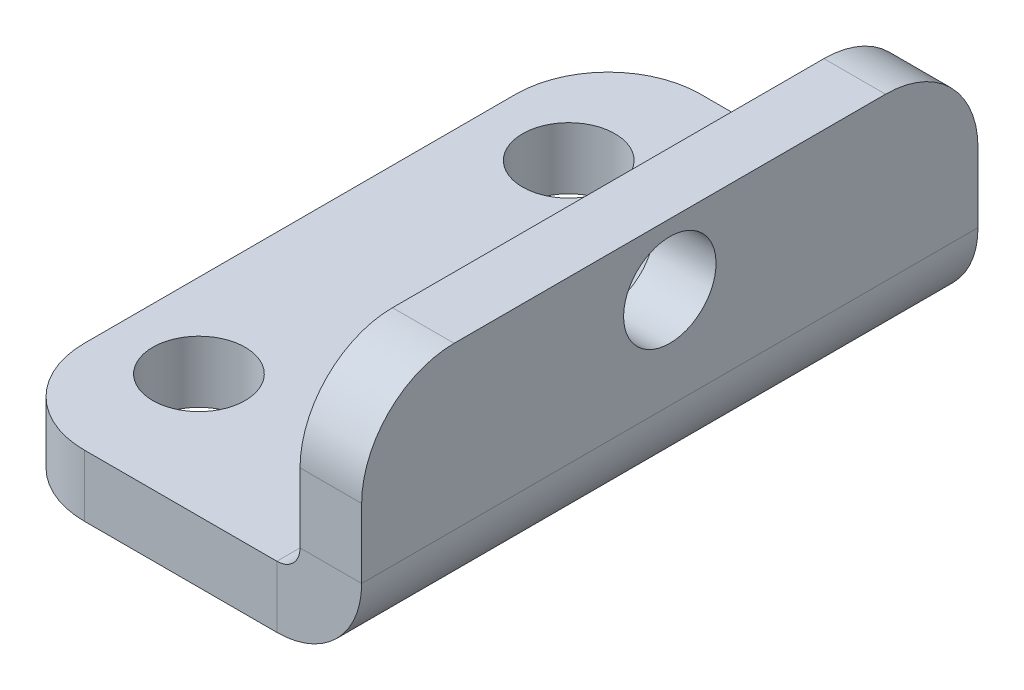
ISO-10303-21;
HEADER;
FILE_DESCRIPTION(('STEP AP214'),'2;1');
FILE_NAME('part.step','',(''),(''),'','','');
FILE_SCHEMA(('AUTOMOTIVE_DESIGN { 1 0 10303 214 1 1 1 1 }'));
ENDSEC;
DATA;
#1=APPLICATION_CONTEXT('core data for automotive mechanical design processes');
#2=APPLICATION_PROTOCOL_DEFINITION('international standard','automotive_design',2000,#1);
#3=PRODUCT_CONTEXT('',#1,'mechanical');
#4=PRODUCT('Part','Part','',(#3));
#5=PRODUCT_RELATED_PRODUCT_CATEGORY('part','',(#4));
#6=PRODUCT_DEFINITION_FORMATION('','',#4);
#7=PRODUCT_DEFINITION_CONTEXT('part definition',#1,'design');
#8=PRODUCT_DEFINITION('design','',#6,#7);
#9=PRODUCT_DEFINITION_SHAPE('','',#8);
#10=(LENGTH_UNIT() NAMED_UNIT(*) SI_UNIT(.MILLI.,.METRE.));
#11=(NAMED_UNIT(*) PLANE_ANGLE_UNIT() SI_UNIT($,.RADIAN.));
#12=(NAMED_UNIT(*) SI_UNIT($,.STERADIAN.) SOLID_ANGLE_UNIT());
#13=UNCERTAINTY_MEASURE_WITH_UNIT(LENGTH_MEASURE(1.E-05),#10,'distance_accuracy_value','');
#14=(GEOMETRIC_REPRESENTATION_CONTEXT(3) GLOBAL_UNCERTAINTY_ASSIGNED_CONTEXT((#13)) GLOBAL_UNIT_ASSIGNED_CONTEXT((#10,
#11,#12)) REPRESENTATION_CONTEXT('',''));
#15=CARTESIAN_POINT('',(0.,0.,0.));
#16=DIRECTION('',(0.,0.,1.));
#17=DIRECTION('',(1.,0.,0.));
#18=AXIS2_PLACEMENT_3D('',#15,#16,#17);
#19=CARTESIAN_POINT('',(-2.75,0.,10.));
#20=DIRECTION('',(0.,0.,1.));
#21=DIRECTION('',(1.,0.,0.));
#22=AXIS2_PLACEMENT_3D('',#19,#20,#21);
#23=PLANE('',#22);
#24=DIRECTION('',(0.,1.,0.));
#25=VECTOR('',#24,1.);
#26=CARTESIAN_POINT('',(-2.75,0.,10.));
#27=LINE('',#26,#25);
#28=CARTESIAN_POINT('',(-2.75,0.,10.));
#29=VERTEX_POINT('',#28);
#30=CARTESIAN_POINT('',(-2.75,2.,10.));
#31=VERTEX_POINT('',#30);
#32=EDGE_CURVE('E137',#29,#31,#27,.T.);
#33=ORIENTED_EDGE('',*,*,#32,.F.);
#34=CARTESIAN_POINT('',(-2.75,2.75,10.));
#35=DIRECTION('',(0.,0.,1.));
#36=DIRECTION('',(1.,0.,0.));
#37=AXIS2_PLACEMENT_3D('',#34,#35,#36);
#38=CIRCLE('',#37,2.75);
#39=CARTESIAN_POINT('',(0.,2.75,10.));
#40=VERTEX_POINT('',#39);
#41=EDGE_CURVE('E141',#40,#29,#38,.F.);
#42=ORIENTED_EDGE('',*,*,#41,.F.);
#43=DIRECTION('',(1.,0.,0.));
#44=VECTOR('',#43,1.);
#45=CARTESIAN_POINT('',(-2.,2.75,10.));
#46=LINE('',#45,#44);
#47=CARTESIAN_POINT('',(-2.,2.75,10.));
#48=VERTEX_POINT('',#47);
#49=EDGE_CURVE('E147',#48,#40,#46,.T.);
#50=ORIENTED_EDGE('',*,*,#49,.F.);
#51=CARTESIAN_POINT('',(-2.75,2.75,10.));
#52=DIRECTION('',(0.,0.,1.));
#53=DIRECTION('',(1.,0.,0.));
#54=AXIS2_PLACEMENT_3D('',#51,#52,#53);
#55=CIRCLE('',#54,0.75);
#56=EDGE_CURVE('E143',#48,#31,#55,.F.);
#57=ORIENTED_EDGE('',*,*,#56,.T.);
#58=EDGE_LOOP('',(#33,#42,#50,#57));
#59=FACE_BOUND('',#58,.T.);
#60=ADVANCED_FACE('F45',(#59),#23,.T.);
#61=CARTESIAN_POINT('',(-2.,2.75,10.));
#62=DIRECTION('',(0.,0.,1.));
#63=DIRECTION('',(1.,0.,0.));
#64=AXIS2_PLACEMENT_3D('',#61,#62,#63);
#65=PLANE('',#64);
#66=DIRECTION('',(1.,0.,0.));
#67=VECTOR('',#66,1.);
#68=CARTESIAN_POINT('',(0.,2.,10.));
#69=LINE('',#68,#67);
#70=CARTESIAN_POINT('',(-9.,2.,10.));
#71=VERTEX_POINT('',#70);
#72=EDGE_CURVE('E167',#31,#71,#69,.F.);
#73=ORIENTED_EDGE('',*,*,#72,.T.);
#74=DIRECTION('',(0.,1.,0.));
#75=VECTOR('',#74,1.);
#76=CARTESIAN_POINT('',(-9.,2.75,10.));
#77=LINE('',#76,#75);
#78=CARTESIAN_POINT('',(-9.,0.,10.));
#79=VERTEX_POINT('',#78);
#80=EDGE_CURVE('E54',#71,#79,#77,.F.);
#81=ORIENTED_EDGE('',*,*,#80,.T.);
#82=DIRECTION('',(-1.,0.,0.));
#83=VECTOR('',#82,1.);
#84=CARTESIAN_POINT('',(0.,0.,10.));
#85=LINE('',#84,#83);
#86=EDGE_CURVE('E154',#29,#79,#85,.T.);
#87=ORIENTED_EDGE('',*,*,#86,.F.);
#88=ORIENTED_EDGE('',*,*,#32,.T.);
#89=EDGE_LOOP('',(#73,#81,#87,#88));
#90=FACE_BOUND('',#89,.T.);
#91=ADVANCED_FACE('F165',(#90),#65,.T.);
#92=CARTESIAN_POINT('',(0.,2.75,-10.));
#93=DIRECTION('',(0.,0.,-1.));
#94=DIRECTION('',(-1.,0.,0.));
#95=AXIS2_PLACEMENT_3D('',#92,#93,#94);
#96=PLANE('',#95);
#97=DIRECTION('',(-1.,0.,0.));
#98=VECTOR('',#97,1.);
#99=CARTESIAN_POINT('',(0.,2.75,-10.));
#100=LINE('',#99,#98);
#101=CARTESIAN_POINT('',(0.,2.75,-10.));
#102=VERTEX_POINT('',#101);
#103=CARTESIAN_POINT('',(-2.,2.75,-10.));
#104=VERTEX_POINT('',#103);
#105=EDGE_CURVE('E230',#102,#104,#100,.T.);
#106=ORIENTED_EDGE('',*,*,#105,.F.);
#107=CARTESIAN_POINT('',(-2.75,2.75,-10.));
#108=DIRECTION('',(0.,0.,1.));
#109=DIRECTION('',(1.,0.,0.));
#110=AXIS2_PLACEMENT_3D('',#107,#108,#109);
#111=CIRCLE('',#110,2.75);
#112=CARTESIAN_POINT('',(-2.75,0.,-10.));
#113=VERTEX_POINT('',#112);
#114=EDGE_CURVE('E192',#102,#113,#111,.F.);
#115=ORIENTED_EDGE('',*,*,#114,.T.);
#116=DIRECTION('',(0.,-1.,0.));
#117=VECTOR('',#116,1.);
#118=CARTESIAN_POINT('',(-2.75,2.,-10.));
#119=LINE('',#118,#117);
#120=CARTESIAN_POINT('',(-2.75,2.,-10.));
#121=VERTEX_POINT('',#120);
#122=EDGE_CURVE('E227',#121,#113,#119,.T.);
#123=ORIENTED_EDGE('',*,*,#122,.F.);
#124=CARTESIAN_POINT('',(-2.75,2.75,-10.));
#125=DIRECTION('',(0.,0.,1.));
#126=DIRECTION('',(1.,0.,0.));
#127=AXIS2_PLACEMENT_3D('',#124,#125,#126);
#128=CIRCLE('',#127,0.75);
#129=EDGE_CURVE('E201',#104,#121,#128,.F.);
#130=ORIENTED_EDGE('',*,*,#129,.F.);
#131=EDGE_LOOP('',(#106,#115,#123,#130));
#132=FACE_BOUND('',#131,.T.);
#133=ADVANCED_FACE('F356',(#132),#96,.T.);
#134=CARTESIAN_POINT('',(-2.75,2.,-10.));
#135=DIRECTION('',(0.,0.,-1.));
#136=DIRECTION('',(-1.,0.,0.));
#137=AXIS2_PLACEMENT_3D('',#134,#135,#136);
#138=PLANE('',#137);
#139=DIRECTION('',(0.,-1.,0.));
#140=VECTOR('',#139,1.);
#141=CARTESIAN_POINT('',(-2.,8.,-10.));
#142=LINE('',#141,#140);
#143=CARTESIAN_POINT('',(-2.,5.,-10.));
#144=VERTEX_POINT('',#143);
#145=EDGE_CURVE('E198',#144,#104,#142,.T.);
#146=ORIENTED_EDGE('',*,*,#145,.F.);
#147=DIRECTION('',(1.,0.,0.));
#148=VECTOR('',#147,1.);
#149=CARTESIAN_POINT('',(-2.75,5.,-10.));
#150=LINE('',#149,#148);
#151=CARTESIAN_POINT('',(0.,5.,-10.));
#152=VERTEX_POINT('',#151);
#153=EDGE_CURVE('E146',#144,#152,#150,.T.);
#154=ORIENTED_EDGE('',*,*,#153,.T.);
#155=DIRECTION('',(0.,-1.,0.));
#156=VECTOR('',#155,1.);
#157=CARTESIAN_POINT('',(0.,8.,-10.));
#158=LINE('',#157,#156);
#159=EDGE_CURVE('E195',#152,#102,#158,.T.);
#160=ORIENTED_EDGE('',*,*,#159,.T.);
#161=ORIENTED_EDGE('',*,*,#105,.T.);
#162=EDGE_LOOP('',(#146,#154,#160,#161));
#163=FACE_BOUND('',#162,.T.);
#164=ADVANCED_FACE('F351',(#163),#138,.T.);
#165=CARTESIAN_POINT('',(0.,2.,10.));
#166=DIRECTION('',(0.,-1.,0.));
#167=DIRECTION('',(0.,0.,-1.));
#168=AXIS2_PLACEMENT_3D('',#165,#166,#167);
#169=PLANE('',#168);
#170=CARTESIAN_POINT('',(-9.28,2.,-6.));
#171=DIRECTION('',(0.,1.,0.));
#172=DIRECTION('',(0.,0.,1.));
#173=AXIS2_PLACEMENT_3D('',#170,#171,#172);
#174=CIRCLE('',#173,1.5);
#175=CARTESIAN_POINT('',(-9.28,2.,-4.5));
#176=VERTEX_POINT('',#175);
#177=EDGE_CURVE('E307',#176,#176,#174,.T.);
#178=ORIENTED_EDGE('',*,*,#177,.F.);
#179=EDGE_LOOP('',(#178));
#180=FACE_BOUND('',#179,.T.);
#181=CARTESIAN_POINT('',(-9.28,2.,6.));
#182=DIRECTION('',(0.,1.,0.));
#183=DIRECTION('',(0.,0.,1.));
#184=AXIS2_PLACEMENT_3D('',#181,#182,#183);
#185=CIRCLE('',#184,1.5);
#186=CARTESIAN_POINT('',(-9.28,2.,7.5));
#187=VERTEX_POINT('',#186);
#188=EDGE_CURVE('E302',#187,#187,#185,.T.);
#189=ORIENTED_EDGE('',*,*,#188,.F.);
#190=EDGE_LOOP('',(#189));
#191=FACE_BOUND('',#190,.T.);
#192=DIRECTION('',(1.,0.,0.));
#193=VECTOR('',#192,1.);
#194=CARTESIAN_POINT('',(0.,2.,-10.));
#195=LINE('',#194,#193);
#196=CARTESIAN_POINT('',(-9.,2.,-10.));
#197=VERTEX_POINT('',#196);
#198=EDGE_CURVE('E185',#121,#197,#195,.F.);
#199=ORIENTED_EDGE('',*,*,#198,.T.);
#200=CARTESIAN_POINT('',(-9.,2.,-7.));
#201=DIRECTION('',(0.,-1.,0.));
#202=DIRECTION('',(0.,0.,-1.));
#203=AXIS2_PLACEMENT_3D('',#200,#201,#202);
#204=CIRCLE('',#203,3.);
#205=CARTESIAN_POINT('',(-12.,2.,-7.));
#206=VERTEX_POINT('',#205);
#207=EDGE_CURVE('E266',#197,#206,#204,.F.);
#208=ORIENTED_EDGE('',*,*,#207,.T.);
#209=DIRECTION('',(0.,0.,-1.));
#210=VECTOR('',#209,1.);
#211=CARTESIAN_POINT('',(-12.,2.,10.));
#212=LINE('',#211,#210);
#213=CARTESIAN_POINT('',(-12.,2.,7.));
#214=VERTEX_POINT('',#213);
#215=EDGE_CURVE('E224',#214,#206,#212,.T.);
#216=ORIENTED_EDGE('',*,*,#215,.F.);
#217=CARTESIAN_POINT('',(-9.,2.,7.));
#218=DIRECTION('',(0.,-1.,0.));
#219=DIRECTION('',(0.,0.,-1.));
#220=AXIS2_PLACEMENT_3D('',#217,#218,#219);
#221=CIRCLE('',#220,3.);
#222=EDGE_CURVE('E263',#214,#71,#221,.F.);
#223=ORIENTED_EDGE('',*,*,#222,.T.);
#224=ORIENTED_EDGE('',*,*,#72,.F.);
#225=DIRECTION('',(0.,0.,-1.));
#226=VECTOR('',#225,1.);
#227=CARTESIAN_POINT('',(-2.75,2.,10.));
#228=LINE('',#227,#226);
#229=EDGE_CURVE('E184',#31,#121,#228,.T.);
#230=ORIENTED_EDGE('',*,*,#229,.T.);
#231=EDGE_LOOP('',(#199,#208,#216,#223,#224,#230));
#232=FACE_BOUND('',#231,.T.);
#233=ADVANCED_FACE('F290',(#180,#191,#232),#169,.F.);
#234=CARTESIAN_POINT('',(-12.,0.,10.));
#235=DIRECTION('',(-1.,0.,0.));
#236=DIRECTION('',(0.,0.,1.));
#237=AXIS2_PLACEMENT_3D('',#234,#235,#236);
#238=PLANE('',#237);
#239=ORIENTED_EDGE('',*,*,#215,.T.);
#240=DIRECTION('',(0.,1.,0.));
#241=VECTOR('',#240,1.);
#242=CARTESIAN_POINT('',(-12.,0.,-7.));
#243=LINE('',#242,#241);
#244=CARTESIAN_POINT('',(-12.,0.,-7.));
#245=VERTEX_POINT('',#244);
#246=EDGE_CURVE('E68',#206,#245,#243,.F.);
#247=ORIENTED_EDGE('',*,*,#246,.T.);
#248=DIRECTION('',(0.,0.,-1.));
#249=VECTOR('',#248,1.);
#250=CARTESIAN_POINT('',(-12.,0.,10.));
#251=LINE('',#250,#249);
#252=CARTESIAN_POINT('',(-12.,0.,7.));
#253=VERTEX_POINT('',#252);
#254=EDGE_CURVE('E162',#253,#245,#251,.T.);
#255=ORIENTED_EDGE('',*,*,#254,.F.);
#256=DIRECTION('',(0.,1.,0.));
#257=VECTOR('',#256,1.);
#258=CARTESIAN_POINT('',(-12.,0.,7.));
#259=LINE('',#258,#257);
#260=EDGE_CURVE('E269',#253,#214,#259,.T.);
#261=ORIENTED_EDGE('',*,*,#260,.T.);
#262=EDGE_LOOP('',(#239,#247,#255,#261));
#263=FACE_BOUND('',#262,.T.);
#264=ADVANCED_FACE('F291',(#263),#238,.T.);
#265=CARTESIAN_POINT('',(0.,0.,10.));
#266=DIRECTION('',(0.,-1.,0.));
#267=DIRECTION('',(0.,0.,-1.));
#268=AXIS2_PLACEMENT_3D('',#265,#266,#267);
#269=PLANE('',#268);
#270=CARTESIAN_POINT('',(-9.28,0.,-6.));
#271=DIRECTION('',(0.,1.,0.));
#272=DIRECTION('',(0.,0.,1.));
#273=AXIS2_PLACEMENT_3D('',#270,#271,#272);
#274=CIRCLE('',#273,1.5);
#275=CARTESIAN_POINT('',(-9.28,0.,-4.5));
#276=VERTEX_POINT('',#275);
#277=EDGE_CURVE('E189',#276,#276,#274,.T.);
#278=ORIENTED_EDGE('',*,*,#277,.T.);
#279=EDGE_LOOP('',(#278));
#280=FACE_BOUND('',#279,.T.);
#281=CARTESIAN_POINT('',(-9.28,0.,6.));
#282=DIRECTION('',(0.,1.,0.));
#283=DIRECTION('',(0.,0.,1.));
#284=AXIS2_PLACEMENT_3D('',#281,#282,#283);
#285=CIRCLE('',#284,1.5);
#286=CARTESIAN_POINT('',(-9.28,0.,7.5));
#287=VERTEX_POINT('',#286);
#288=EDGE_CURVE('E298',#287,#287,#285,.T.);
#289=ORIENTED_EDGE('',*,*,#288,.T.);
#290=EDGE_LOOP('',(#289));
#291=FACE_BOUND('',#290,.T.);
#292=ORIENTED_EDGE('',*,*,#254,.T.);
#293=CARTESIAN_POINT('',(-9.,0.,-7.));
#294=DIRECTION('',(0.,-1.,0.));
#295=DIRECTION('',(0.,0.,-1.));
#296=AXIS2_PLACEMENT_3D('',#293,#294,#295);
#297=CIRCLE('',#296,3.);
#298=CARTESIAN_POINT('',(-9.,0.,-10.));
#299=VERTEX_POINT('',#298);
#300=EDGE_CURVE('E278',#245,#299,#297,.T.);
#301=ORIENTED_EDGE('',*,*,#300,.T.);
#302=DIRECTION('',(-1.,0.,0.));
#303=VECTOR('',#302,1.);
#304=CARTESIAN_POINT('',(0.,0.,-10.));
#305=LINE('',#304,#303);
#306=EDGE_CURVE('E157',#113,#299,#305,.T.);
#307=ORIENTED_EDGE('',*,*,#306,.F.);
#308=DIRECTION('',(0.,0.,-1.));
#309=VECTOR('',#308,1.);
#310=CARTESIAN_POINT('',(-2.75,0.,10.));
#311=LINE('',#310,#309);
#312=EDGE_CURVE('E152',#29,#113,#311,.T.);
#313=ORIENTED_EDGE('',*,*,#312,.F.);
#314=ORIENTED_EDGE('',*,*,#86,.T.);
#315=CARTESIAN_POINT('',(-9.,0.,7.));
#316=DIRECTION('',(0.,-1.,0.));
#317=DIRECTION('',(0.,0.,-1.));
#318=AXIS2_PLACEMENT_3D('',#315,#316,#317);
#319=CIRCLE('',#318,3.);
#320=EDGE_CURVE('E275',#79,#253,#319,.T.);
#321=ORIENTED_EDGE('',*,*,#320,.T.);
#322=EDGE_LOOP('',(#292,#301,#307,#313,#314,#321));
#323=FACE_BOUND('',#322,.T.);
#324=ADVANCED_FACE('F153',(#280,#291,#323),#269,.T.);
#325=CARTESIAN_POINT('',(-2.75,2.75,10.));
#326=DIRECTION('',(0.,0.,-1.));
#327=DIRECTION('',(-1.,0.,0.));
#328=AXIS2_PLACEMENT_3D('',#325,#326,#327);
#329=CYLINDRICAL_SURFACE('',#328,2.75);
#330=ORIENTED_EDGE('',*,*,#114,.F.);
#331=DIRECTION('',(0.,0.,-1.));
#332=VECTOR('',#331,1.);
#333=CARTESIAN_POINT('',(0.,2.75,10.));
#334=LINE('',#333,#332);
#335=EDGE_CURVE('E163',#40,#102,#334,.T.);
#336=ORIENTED_EDGE('',*,*,#335,.F.);
#337=ORIENTED_EDGE('',*,*,#41,.T.);
#338=ORIENTED_EDGE('',*,*,#312,.T.);
#339=EDGE_LOOP('',(#330,#336,#337,#338));
#340=FACE_BOUND('',#339,.T.);
#341=ADVANCED_FACE('F170',(#340),#329,.T.);
#342=CARTESIAN_POINT('',(0.,8.,10.));
#343=DIRECTION('',(1.,0.,0.));
#344=DIRECTION('',(0.,1.,0.));
#345=AXIS2_PLACEMENT_3D('',#342,#343,#344);
#346=PLANE('',#345);
#347=CARTESIAN_POINT('',(0.,6.,0.));
#348=DIRECTION('',(-1.,0.,0.));
#349=DIRECTION('',(0.,-1.,0.));
#350=AXIS2_PLACEMENT_3D('',#347,#348,#349);
#351=CIRCLE('',#350,1.5);
#352=CARTESIAN_POINT('',(0.,4.5,0.));
#353=VERTEX_POINT('',#352);
#354=EDGE_CURVE('E303',#353,#353,#351,.T.);
#355=ORIENTED_EDGE('',*,*,#354,.T.);
#356=EDGE_LOOP('',(#355));
#357=FACE_BOUND('',#356,.T.);
#358=ORIENTED_EDGE('',*,*,#159,.F.);
#359=CARTESIAN_POINT('',(0.,5.,-7.));
#360=DIRECTION('',(1.,0.,0.));
#361=DIRECTION('',(0.,1.,0.));
#362=AXIS2_PLACEMENT_3D('',#359,#360,#361);
#363=CIRCLE('',#362,3.);
#364=CARTESIAN_POINT('',(0.,8.,-7.));
#365=VERTEX_POINT('',#364);
#366=EDGE_CURVE('E243',#152,#365,#363,.T.);
#367=ORIENTED_EDGE('',*,*,#366,.T.);
#368=DIRECTION('',(0.,0.,-1.));
#369=VECTOR('',#368,1.);
#370=CARTESIAN_POINT('',(0.,8.,10.));
#371=LINE('',#370,#369);
#372=CARTESIAN_POINT('',(0.,8.,7.));
#373=VERTEX_POINT('',#372);
#374=EDGE_CURVE('E216',#373,#365,#371,.T.);
#375=ORIENTED_EDGE('',*,*,#374,.F.);
#376=CARTESIAN_POINT('',(0.,5.,7.));
#377=DIRECTION('',(1.,0.,0.));
#378=DIRECTION('',(0.,1.,0.));
#379=AXIS2_PLACEMENT_3D('',#376,#377,#378);
#380=CIRCLE('',#379,3.);
#381=CARTESIAN_POINT('',(0.,5.,10.));
#382=VERTEX_POINT('',#381);
#383=EDGE_CURVE('E240',#373,#382,#380,.T.);
#384=ORIENTED_EDGE('',*,*,#383,.T.);
#385=DIRECTION('',(0.,-1.,0.));
#386=VECTOR('',#385,1.);
#387=CARTESIAN_POINT('',(0.,8.,10.));
#388=LINE('',#387,#386);
#389=EDGE_CURVE('E173',#382,#40,#388,.T.);
#390=ORIENTED_EDGE('',*,*,#389,.T.);
#391=ORIENTED_EDGE('',*,*,#335,.T.);
#392=EDGE_LOOP('',(#358,#367,#375,#384,#390,#391));
#393=FACE_BOUND('',#392,.T.);
#394=ADVANCED_FACE('F322',(#357,#393),#346,.T.);
#395=CARTESIAN_POINT('',(-2.,8.,10.));
#396=DIRECTION('',(0.,1.,0.));
#397=DIRECTION('',(0.,0.,1.));
#398=AXIS2_PLACEMENT_3D('',#395,#396,#397);
#399=PLANE('',#398);
#400=ORIENTED_EDGE('',*,*,#374,.T.);
#401=DIRECTION('',(1.,0.,0.));
#402=VECTOR('',#401,1.);
#403=CARTESIAN_POINT('',(-2.,8.,-7.));
#404=LINE('',#403,#402);
#405=CARTESIAN_POINT('',(-2.,8.,-7.));
#406=VERTEX_POINT('',#405);
#407=EDGE_CURVE('E250',#365,#406,#404,.F.);
#408=ORIENTED_EDGE('',*,*,#407,.T.);
#409=DIRECTION('',(0.,0.,-1.));
#410=VECTOR('',#409,1.);
#411=CARTESIAN_POINT('',(-2.,8.,10.));
#412=LINE('',#411,#410);
#413=CARTESIAN_POINT('',(-2.,8.,7.));
#414=VERTEX_POINT('',#413);
#415=EDGE_CURVE('E212',#414,#406,#412,.T.);
#416=ORIENTED_EDGE('',*,*,#415,.F.);
#417=DIRECTION('',(1.,0.,0.));
#418=VECTOR('',#417,1.);
#419=CARTESIAN_POINT('',(-2.,8.,7.));
#420=LINE('',#419,#418);
#421=EDGE_CURVE('E246',#414,#373,#420,.T.);
#422=ORIENTED_EDGE('',*,*,#421,.T.);
#423=EDGE_LOOP('',(#400,#408,#416,#422));
#424=FACE_BOUND('',#423,.T.);
#425=ADVANCED_FACE('F336',(#424),#399,.T.);
#426=CARTESIAN_POINT('',(-2.,8.,10.));
#427=DIRECTION('',(1.,0.,0.));
#428=DIRECTION('',(0.,1.,0.));
#429=AXIS2_PLACEMENT_3D('',#426,#427,#428);
#430=PLANE('',#429);
#431=CARTESIAN_POINT('',(-2.,6.,0.));
#432=DIRECTION('',(-1.,0.,0.));
#433=DIRECTION('',(0.,-1.,0.));
#434=AXIS2_PLACEMENT_3D('',#431,#432,#433);
#435=CIRCLE('',#434,1.5);
#436=CARTESIAN_POINT('',(-2.,4.5,0.));
#437=VERTEX_POINT('',#436);
#438=EDGE_CURVE('E314',#437,#437,#435,.T.);
#439=ORIENTED_EDGE('',*,*,#438,.F.);
#440=EDGE_LOOP('',(#439));
#441=FACE_BOUND('',#440,.T.);
#442=ORIENTED_EDGE('',*,*,#415,.T.);
#443=CARTESIAN_POINT('',(-2.,5.,-7.));
#444=DIRECTION('',(1.,0.,0.));
#445=DIRECTION('',(0.,1.,0.));
#446=AXIS2_PLACEMENT_3D('',#443,#444,#445);
#447=CIRCLE('',#446,3.);
#448=EDGE_CURVE('E256',#406,#144,#447,.F.);
#449=ORIENTED_EDGE('',*,*,#448,.T.);
#450=ORIENTED_EDGE('',*,*,#145,.T.);
#451=DIRECTION('',(0.,0.,-1.));
#452=VECTOR('',#451,1.);
#453=CARTESIAN_POINT('',(-2.,2.75,10.));
#454=LINE('',#453,#452);
#455=EDGE_CURVE('E208',#48,#104,#454,.T.);
#456=ORIENTED_EDGE('',*,*,#455,.F.);
#457=DIRECTION('',(0.,-1.,0.));
#458=VECTOR('',#457,1.);
#459=CARTESIAN_POINT('',(-2.,8.,10.));
#460=LINE('',#459,#458);
#461=CARTESIAN_POINT('',(-2.,5.,10.));
#462=VERTEX_POINT('',#461);
#463=EDGE_CURVE('E176',#462,#48,#460,.T.);
#464=ORIENTED_EDGE('',*,*,#463,.F.);
#465=CARTESIAN_POINT('',(-2.,5.,7.));
#466=DIRECTION('',(1.,0.,0.));
#467=DIRECTION('',(0.,1.,0.));
#468=AXIS2_PLACEMENT_3D('',#465,#466,#467);
#469=CIRCLE('',#468,3.);
#470=EDGE_CURVE('E253',#462,#414,#469,.F.);
#471=ORIENTED_EDGE('',*,*,#470,.T.);
#472=EDGE_LOOP('',(#442,#449,#450,#456,#464,#471));
#473=FACE_BOUND('',#472,.T.);
#474=ADVANCED_FACE('F332',(#441,#473),#430,.F.);
#475=CARTESIAN_POINT('',(-2.75,2.75,10.));
#476=DIRECTION('',(0.,0.,-1.));
#477=DIRECTION('',(-1.,0.,0.));
#478=AXIS2_PLACEMENT_3D('',#475,#476,#477);
#479=CYLINDRICAL_SURFACE('',#478,0.75);
#480=ORIENTED_EDGE('',*,*,#129,.T.);
#481=ORIENTED_EDGE('',*,*,#229,.F.);
#482=ORIENTED_EDGE('',*,*,#56,.F.);
#483=ORIENTED_EDGE('',*,*,#455,.T.);
#484=EDGE_LOOP('',(#480,#481,#482,#483));
#485=FACE_BOUND('',#484,.T.);
#486=ADVANCED_FACE('F335',(#485),#479,.F.);
#487=CARTESIAN_POINT('',(-2.75,2.75,10.));
#488=DIRECTION('',(0.,0.,1.));
#489=DIRECTION('',(1.,0.,0.));
#490=AXIS2_PLACEMENT_3D('',#487,#488,#489);
#491=PLANE('',#490);
#492=ORIENTED_EDGE('',*,*,#389,.F.);
#493=DIRECTION('',(1.,0.,0.));
#494=VECTOR('',#493,1.);
#495=CARTESIAN_POINT('',(-2.75,5.,10.));
#496=LINE('',#495,#494);
#497=EDGE_CURVE('E11',#382,#462,#496,.F.);
#498=ORIENTED_EDGE('',*,*,#497,.T.);
#499=ORIENTED_EDGE('',*,*,#463,.T.);
#500=ORIENTED_EDGE('',*,*,#49,.T.);
#501=EDGE_LOOP('',(#492,#498,#499,#500));
#502=FACE_BOUND('',#501,.T.);
#503=ADVANCED_FACE('F363',(#502),#491,.T.);
#504=CARTESIAN_POINT('',(-2.75,2.75,-10.));
#505=DIRECTION('',(0.,0.,1.));
#506=DIRECTION('',(1.,0.,0.));
#507=AXIS2_PLACEMENT_3D('',#504,#505,#506);
#508=PLANE('',#507);
#509=ORIENTED_EDGE('',*,*,#306,.T.);
#510=DIRECTION('',(0.,1.,0.));
#511=VECTOR('',#510,1.);
#512=CARTESIAN_POINT('',(-9.,2.,-10.));
#513=LINE('',#512,#511);
#514=EDGE_CURVE('E259',#299,#197,#513,.T.);
#515=ORIENTED_EDGE('',*,*,#514,.T.);
#516=ORIENTED_EDGE('',*,*,#198,.F.);
#517=ORIENTED_EDGE('',*,*,#122,.T.);
#518=EDGE_LOOP('',(#509,#515,#516,#517));
#519=FACE_BOUND('',#518,.T.);
#520=ADVANCED_FACE('F285',(#519),#508,.F.);
#521=CARTESIAN_POINT('',(-2.75,5.,-7.));
#522=DIRECTION('',(1.,0.,0.));
#523=DIRECTION('',(0.,0.,-1.));
#524=AXIS2_PLACEMENT_3D('',#521,#522,#523);
#525=CYLINDRICAL_SURFACE('',#524,3.);
#526=ORIENTED_EDGE('',*,*,#448,.F.);
#527=ORIENTED_EDGE('',*,*,#407,.F.);
#528=ORIENTED_EDGE('',*,*,#366,.F.);
#529=ORIENTED_EDGE('',*,*,#153,.F.);
#530=EDGE_LOOP('',(#526,#527,#528,#529));
#531=FACE_BOUND('',#530,.T.);
#532=ADVANCED_FACE('F348',(#531),#525,.T.);
#533=CARTESIAN_POINT('',(-9.,2.75,-7.));
#534=DIRECTION('',(0.,-1.,0.));
#535=DIRECTION('',(0.,0.,-1.));
#536=AXIS2_PLACEMENT_3D('',#533,#534,#535);
#537=CYLINDRICAL_SURFACE('',#536,3.);
#538=ORIENTED_EDGE('',*,*,#300,.F.);
#539=ORIENTED_EDGE('',*,*,#246,.F.);
#540=ORIENTED_EDGE('',*,*,#207,.F.);
#541=ORIENTED_EDGE('',*,*,#514,.F.);
#542=EDGE_LOOP('',(#538,#539,#540,#541));
#543=FACE_BOUND('',#542,.T.);
#544=ADVANCED_FACE('F287',(#543),#537,.T.);
#545=CARTESIAN_POINT('',(-9.,0.,7.));
#546=DIRECTION('',(0.,1.,0.));
#547=DIRECTION('',(0.,0.,1.));
#548=AXIS2_PLACEMENT_3D('',#545,#546,#547);
#549=CYLINDRICAL_SURFACE('',#548,3.);
#550=ORIENTED_EDGE('',*,*,#320,.F.);
#551=ORIENTED_EDGE('',*,*,#80,.F.);
#552=ORIENTED_EDGE('',*,*,#222,.F.);
#553=ORIENTED_EDGE('',*,*,#260,.F.);
#554=EDGE_LOOP('',(#550,#551,#552,#553));
#555=FACE_BOUND('',#554,.T.);
#556=ADVANCED_FACE('F294',(#555),#549,.T.);
#557=CARTESIAN_POINT('',(-2.,5.,7.));
#558=DIRECTION('',(1.,0.,0.));
#559=DIRECTION('',(0.,0.,-1.));
#560=AXIS2_PLACEMENT_3D('',#557,#558,#559);
#561=CYLINDRICAL_SURFACE('',#560,3.);
#562=ORIENTED_EDGE('',*,*,#470,.F.);
#563=ORIENTED_EDGE('',*,*,#497,.F.);
#564=ORIENTED_EDGE('',*,*,#383,.F.);
#565=ORIENTED_EDGE('',*,*,#421,.F.);
#566=EDGE_LOOP('',(#562,#563,#564,#565));
#567=FACE_BOUND('',#566,.T.);
#568=ADVANCED_FACE('F47',(#567),#561,.T.);
#569=CARTESIAN_POINT('',(-9.28,0.,6.));
#570=DIRECTION('',(0.,1.,0.));
#571=DIRECTION('',(0.,0.,1.));
#572=AXIS2_PLACEMENT_3D('',#569,#570,#571);
#573=CYLINDRICAL_SURFACE('',#572,1.5);
#574=ORIENTED_EDGE('',*,*,#288,.F.);
#575=EDGE_LOOP('',(#574));
#576=FACE_BOUND('',#575,.T.);
#577=ORIENTED_EDGE('',*,*,#188,.T.);
#578=EDGE_LOOP('',(#577));
#579=FACE_BOUND('',#578,.T.);
#580=ADVANCED_FACE('F388',(#576,#579),#573,.F.);
#581=CARTESIAN_POINT('',(-9.28,0.,-6.));
#582=DIRECTION('',(0.,1.,0.));
#583=DIRECTION('',(0.,0.,1.));
#584=AXIS2_PLACEMENT_3D('',#581,#582,#583);
#585=CYLINDRICAL_SURFACE('',#584,1.5);
#586=ORIENTED_EDGE('',*,*,#277,.F.);
#587=EDGE_LOOP('',(#586));
#588=FACE_BOUND('',#587,.T.);
#589=ORIENTED_EDGE('',*,*,#177,.T.);
#590=EDGE_LOOP('',(#589));
#591=FACE_BOUND('',#590,.T.);
#592=ADVANCED_FACE('F328',(#588,#591),#585,.F.);
#593=CARTESIAN_POINT('',(0.,6.,0.));
#594=DIRECTION('',(-1.,0.,0.));
#595=DIRECTION('',(0.,-1.,0.));
#596=AXIS2_PLACEMENT_3D('',#593,#594,#595);
#597=CYLINDRICAL_SURFACE('',#596,1.5);
#598=ORIENTED_EDGE('',*,*,#354,.F.);
#599=EDGE_LOOP('',(#598));
#600=FACE_BOUND('',#599,.T.);
#601=ORIENTED_EDGE('',*,*,#438,.T.);
#602=EDGE_LOOP('',(#601));
#603=FACE_BOUND('',#602,.T.);
#604=ADVANCED_FACE('F325',(#600,#603),#597,.F.);
#605=CLOSED_SHELL('',(#60,#91,#133,#164,#233,#264,#324,#341,#394,#425,#474,#486,#503,#520,#532,
#544,#556,#568,#580,#592,#604));
#606=MANIFOLD_SOLID_BREP('B2',#605);
#607=ADVANCED_BREP_SHAPE_REPRESENTATION('',(#18,#606),#14);
#608=SHAPE_DEFINITION_REPRESENTATION(#9,#607);
ENDSEC;
END-ISO-10303-21;
